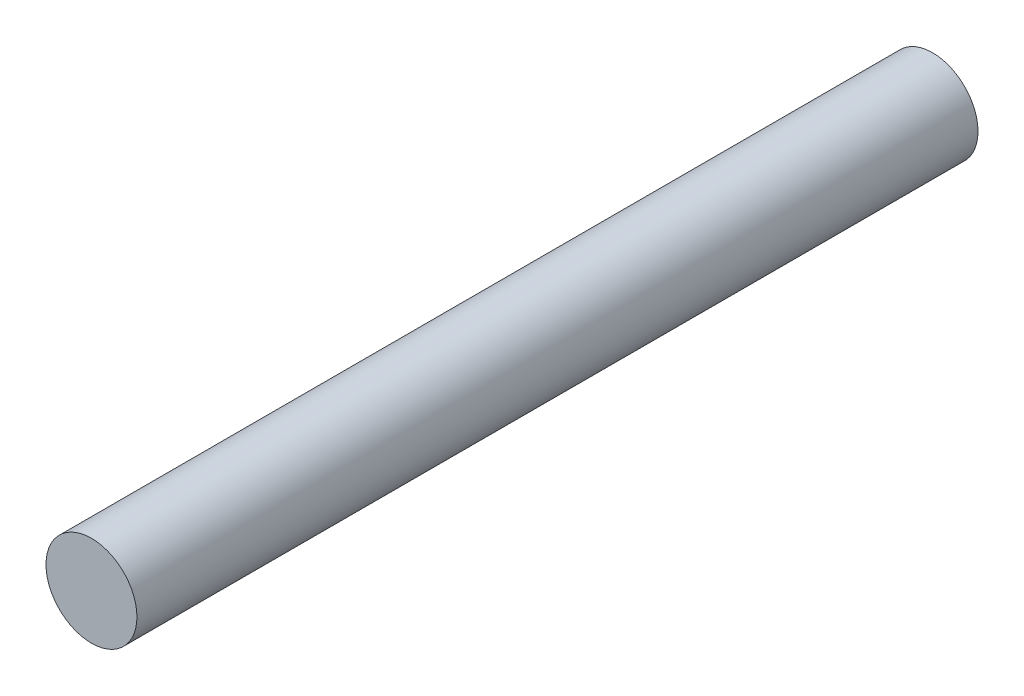
ISO-10303-21;
HEADER;
FILE_DESCRIPTION(('STEP AP214'),'2;1');
FILE_NAME('part.step','',(''),(''),'','','');
FILE_SCHEMA(('AUTOMOTIVE_DESIGN { 1 0 10303 214 1 1 1 1 }'));
ENDSEC;
DATA;
#1=APPLICATION_CONTEXT('core data for automotive mechanical design processes');
#2=APPLICATION_PROTOCOL_DEFINITION('international standard','automotive_design',2000,#1);
#3=PRODUCT_CONTEXT('',#1,'mechanical');
#4=PRODUCT('Part','Part','',(#3));
#5=PRODUCT_RELATED_PRODUCT_CATEGORY('part','',(#4));
#6=PRODUCT_DEFINITION_FORMATION('','',#4);
#7=PRODUCT_DEFINITION_CONTEXT('part definition',#1,'design');
#8=PRODUCT_DEFINITION('design','',#6,#7);
#9=PRODUCT_DEFINITION_SHAPE('','',#8);
#10=(LENGTH_UNIT() NAMED_UNIT(*) SI_UNIT(.MILLI.,.METRE.));
#11=(NAMED_UNIT(*) PLANE_ANGLE_UNIT() SI_UNIT($,.RADIAN.));
#12=(NAMED_UNIT(*) SI_UNIT($,.STERADIAN.) SOLID_ANGLE_UNIT());
#13=UNCERTAINTY_MEASURE_WITH_UNIT(LENGTH_MEASURE(1.E-05),#10,'distance_accuracy_value','');
#14=(GEOMETRIC_REPRESENTATION_CONTEXT(3) GLOBAL_UNCERTAINTY_ASSIGNED_CONTEXT((#13)) GLOBAL_UNIT_ASSIGNED_CONTEXT((#10,
#11,#12)) REPRESENTATION_CONTEXT('',''));
#15=CARTESIAN_POINT('',(0.,0.,0.));
#16=DIRECTION('',(0.,0.,1.));
#17=DIRECTION('',(1.,0.,0.));
#18=AXIS2_PLACEMENT_3D('',#15,#16,#17);
#19=CARTESIAN_POINT('',(0.,0.,37.));
#20=DIRECTION('',(0.,0.,1.));
#21=DIRECTION('',(1.,0.,0.));
#22=AXIS2_PLACEMENT_3D('',#19,#20,#21);
#23=PLANE('',#22);
#24=CARTESIAN_POINT('',(0.,0.,37.));
#25=DIRECTION('',(0.,0.,-1.));
#26=DIRECTION('',(-1.,0.,0.));
#27=AXIS2_PLACEMENT_3D('',#24,#25,#26);
#28=CIRCLE('',#27,4.);
#29=CARTESIAN_POINT('',(-4.,0.,37.));
#30=VERTEX_POINT('',#29);
#31=EDGE_CURVE('E9',#30,#30,#28,.T.);
#32=ORIENTED_EDGE('',*,*,#31,.F.);
#33=EDGE_LOOP('',(#32));
#34=FACE_BOUND('',#33,.T.);
#35=ADVANCED_FACE('F14',(#34),#23,.T.);
#36=CARTESIAN_POINT('',(0.,0.,-37.));
#37=DIRECTION('',(0.,0.,-1.));
#38=DIRECTION('',(-1.,0.,0.));
#39=AXIS2_PLACEMENT_3D('',#36,#37,#38);
#40=PLANE('',#39);
#41=CARTESIAN_POINT('',(0.,0.,-37.));
#42=DIRECTION('',(0.,0.,1.));
#43=DIRECTION('',(1.,0.,0.));
#44=AXIS2_PLACEMENT_3D('',#41,#42,#43);
#45=CIRCLE('',#44,4.);
#46=CARTESIAN_POINT('',(4.,0.,-37.));
#47=VERTEX_POINT('',#46);
#48=EDGE_CURVE('E21',#47,#47,#45,.T.);
#49=ORIENTED_EDGE('',*,*,#48,.F.);
#50=EDGE_LOOP('',(#49));
#51=FACE_BOUND('',#50,.T.);
#52=ADVANCED_FACE('F29',(#51),#40,.T.);
#53=CARTESIAN_POINT('',(0.,0.,-37.));
#54=DIRECTION('',(0.,0.,1.));
#55=DIRECTION('',(1.,0.,0.));
#56=AXIS2_PLACEMENT_3D('',#53,#54,#55);
#57=CYLINDRICAL_SURFACE('',#56,4.);
#58=ORIENTED_EDGE('',*,*,#31,.T.);
#59=EDGE_LOOP('',(#58));
#60=FACE_BOUND('',#59,.T.);
#61=ORIENTED_EDGE('',*,*,#48,.T.);
#62=EDGE_LOOP('',(#61));
#63=FACE_BOUND('',#62,.T.);
#64=ADVANCED_FACE('F16',(#60,#63),#57,.T.);
#65=CLOSED_SHELL('',(#35,#52,#64));
#66=MANIFOLD_SOLID_BREP('B1',#65);
#67=ADVANCED_BREP_SHAPE_REPRESENTATION('',(#18,#66),#14);
#68=SHAPE_DEFINITION_REPRESENTATION(#9,#67);
ENDSEC;
END-ISO-10303-21;
